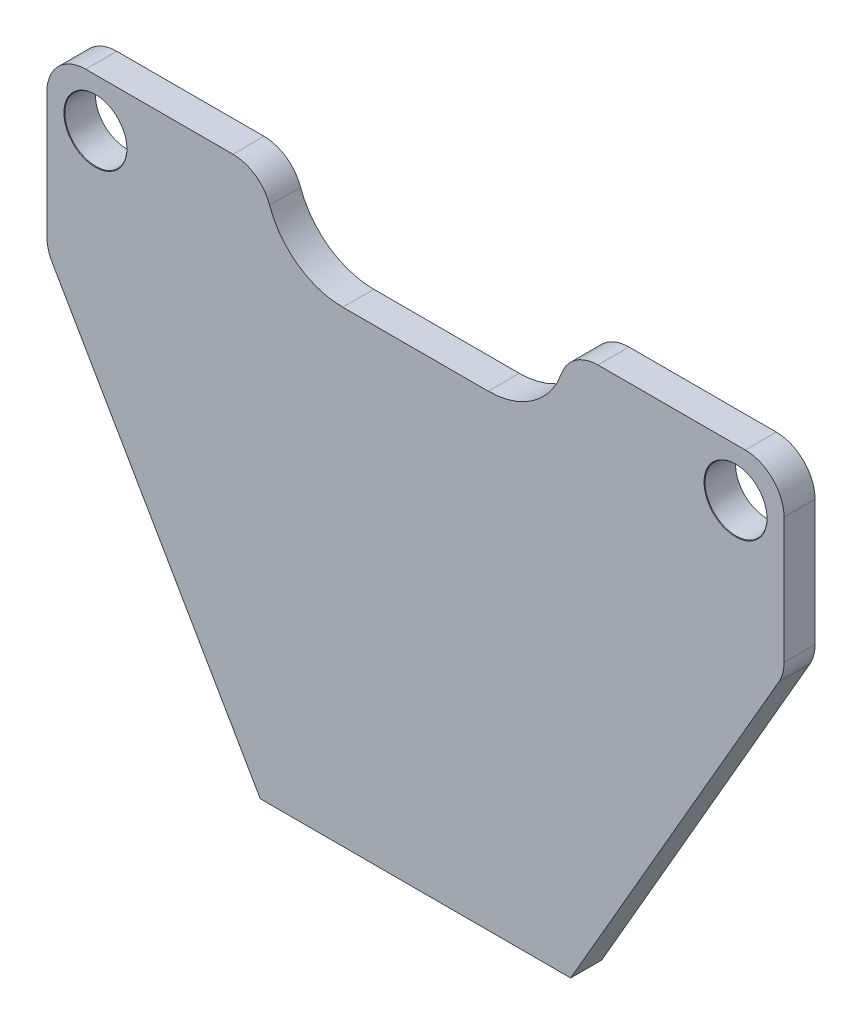
ISO-10303-21;
HEADER;
FILE_DESCRIPTION(('STEP AP214'),'2;1');
FILE_NAME('part.step','',(''),(''),'','','');
FILE_SCHEMA(('AUTOMOTIVE_DESIGN { 1 0 10303 214 1 1 1 1 }'));
ENDSEC;
DATA;
#1=APPLICATION_CONTEXT('core data for automotive mechanical design processes');
#2=APPLICATION_PROTOCOL_DEFINITION('international standard','automotive_design',2000,#1);
#3=PRODUCT_CONTEXT('',#1,'mechanical');
#4=PRODUCT('Part','Part','',(#3));
#5=PRODUCT_RELATED_PRODUCT_CATEGORY('part','',(#4));
#6=PRODUCT_DEFINITION_FORMATION('','',#4);
#7=PRODUCT_DEFINITION_CONTEXT('part definition',#1,'design');
#8=PRODUCT_DEFINITION('design','',#6,#7);
#9=PRODUCT_DEFINITION_SHAPE('','',#8);
#10=(LENGTH_UNIT() NAMED_UNIT(*) SI_UNIT(.MILLI.,.METRE.));
#11=(NAMED_UNIT(*) PLANE_ANGLE_UNIT() SI_UNIT($,.RADIAN.));
#12=(NAMED_UNIT(*) SI_UNIT($,.STERADIAN.) SOLID_ANGLE_UNIT());
#13=UNCERTAINTY_MEASURE_WITH_UNIT(LENGTH_MEASURE(1.E-05),#10,'distance_accuracy_value','');
#14=(GEOMETRIC_REPRESENTATION_CONTEXT(3) GLOBAL_UNCERTAINTY_ASSIGNED_CONTEXT((#13)) GLOBAL_UNIT_ASSIGNED_CONTEXT((#10,
#11,#12)) REPRESENTATION_CONTEXT('',''));
#15=CARTESIAN_POINT('',(0.,0.,0.));
#16=DIRECTION('',(0.,0.,1.));
#17=DIRECTION('',(1.,0.,0.));
#18=AXIS2_PLACEMENT_3D('',#15,#16,#17);
#19=CARTESIAN_POINT('',(-19.,38.0525588832576,1.6));
#20=DIRECTION('',(1.,0.,0.));
#21=DIRECTION('',(0.,0.,-1.));
#22=AXIS2_PLACEMENT_3D('',#19,#20,#21);
#23=PLANE('',#22);
#24=DIRECTION('',(0.,-1.,0.));
#25=VECTOR('',#24,1.);
#26=CARTESIAN_POINT('',(-19.,38.0525588832576,0.));
#27=LINE('',#26,#25);
#28=CARTESIAN_POINT('',(-19.,45.0731959577377,0.));
#29=VERTEX_POINT('',#28);
#30=CARTESIAN_POINT('',(-19.,38.5884572681199,0.));
#31=VERTEX_POINT('',#30);
#32=EDGE_CURVE('E210',#29,#31,#27,.T.);
#33=ORIENTED_EDGE('',*,*,#32,.T.);
#34=DIRECTION('',(0.,0.,-1.));
#35=VECTOR('',#34,1.);
#36=CARTESIAN_POINT('',(-19.,38.5884572681199,1.6));
#37=LINE('',#36,#35);
#38=CARTESIAN_POINT('',(-19.,38.5884572681199,1.6));
#39=VERTEX_POINT('',#38);
#40=EDGE_CURVE('E304',#31,#39,#37,.F.);
#41=ORIENTED_EDGE('',*,*,#40,.T.);
#42=DIRECTION('',(0.,-1.,0.));
#43=VECTOR('',#42,1.);
#44=CARTESIAN_POINT('',(-19.,38.0525588832576,1.6));
#45=LINE('',#44,#43);
#46=CARTESIAN_POINT('',(-19.,45.0731959577377,1.6));
#47=VERTEX_POINT('',#46);
#48=EDGE_CURVE('E165',#47,#39,#45,.T.);
#49=ORIENTED_EDGE('',*,*,#48,.F.);
#50=DIRECTION('',(0.,0.,-1.));
#51=VECTOR('',#50,1.);
#52=CARTESIAN_POINT('',(-19.,45.0731959577377,1.6));
#53=LINE('',#52,#51);
#54=EDGE_CURVE('E300',#47,#29,#53,.T.);
#55=ORIENTED_EDGE('',*,*,#54,.T.);
#56=EDGE_LOOP('',(#33,#41,#49,#55));
#57=FACE_BOUND('',#56,.T.);
#58=ADVANCED_FACE('F38',(#57),#23,.F.);
#59=CARTESIAN_POINT('',(-7.99999999999999,19.,1.6));
#60=DIRECTION('',(0.866025403784438,0.500000000000001,0.));
#61=DIRECTION('',(-0.500000000000001,0.866025403784438,0.));
#62=AXIS2_PLACEMENT_3D('',#59,#60,#61);
#63=PLANE('',#62);
#64=DIRECTION('',(0.500000000000001,-0.866025403784438,0.));
#65=VECTOR('',#64,1.);
#66=CARTESIAN_POINT('',(-7.99999999999999,19.,1.6));
#67=LINE('',#66,#65);
#68=CARTESIAN_POINT('',(-18.7320508075689,37.5884572681199,1.6));
#69=VERTEX_POINT('',#68);
#70=CARTESIAN_POINT('',(-7.99999999999999,19.,1.6));
#71=VERTEX_POINT('',#70);
#72=EDGE_CURVE('E151',#69,#71,#67,.T.);
#73=ORIENTED_EDGE('',*,*,#72,.F.);
#74=DIRECTION('',(0.,0.,-1.));
#75=VECTOR('',#74,1.);
#76=CARTESIAN_POINT('',(-18.7320508075689,37.5884572681199,1.6));
#77=LINE('',#76,#75);
#78=CARTESIAN_POINT('',(-18.7320508075689,37.5884572681199,0.));
#79=VERTEX_POINT('',#78);
#80=EDGE_CURVE('E297',#69,#79,#77,.T.);
#81=ORIENTED_EDGE('',*,*,#80,.T.);
#82=DIRECTION('',(0.500000000000001,-0.866025403784438,0.));
#83=VECTOR('',#82,1.);
#84=CARTESIAN_POINT('',(-7.99999999999999,19.,0.));
#85=LINE('',#84,#83);
#86=CARTESIAN_POINT('',(-7.99999999999999,19.,0.));
#87=VERTEX_POINT('',#86);
#88=EDGE_CURVE('E171',#79,#87,#85,.T.);
#89=ORIENTED_EDGE('',*,*,#88,.T.);
#90=DIRECTION('',(0.,0.,-1.));
#91=VECTOR('',#90,1.);
#92=CARTESIAN_POINT('',(-7.99999999999999,19.,1.6));
#93=LINE('',#92,#91);
#94=EDGE_CURVE('E168',#71,#87,#93,.T.);
#95=ORIENTED_EDGE('',*,*,#94,.F.);
#96=EDGE_LOOP('',(#73,#81,#89,#95));
#97=FACE_BOUND('',#96,.T.);
#98=ADVANCED_FACE('F169',(#97),#63,.F.);
#99=CARTESIAN_POINT('',(8.00000000000001,19.,1.6));
#100=DIRECTION('',(0.,1.,0.));
#101=DIRECTION('',(-1.,0.,0.));
#102=AXIS2_PLACEMENT_3D('',#99,#100,#101);
#103=PLANE('',#102);
#104=DIRECTION('',(1.,0.,0.));
#105=VECTOR('',#104,1.);
#106=CARTESIAN_POINT('',(8.00000000000001,19.,0.));
#107=LINE('',#106,#105);
#108=CARTESIAN_POINT('',(8.00000000000001,19.,0.));
#109=VERTEX_POINT('',#108);
#110=EDGE_CURVE('E217',#87,#109,#107,.T.);
#111=ORIENTED_EDGE('',*,*,#110,.T.);
#112=DIRECTION('',(0.,0.,-1.));
#113=VECTOR('',#112,1.);
#114=CARTESIAN_POINT('',(8.00000000000001,19.,1.6));
#115=LINE('',#114,#113);
#116=CARTESIAN_POINT('',(8.00000000000001,19.,1.6));
#117=VERTEX_POINT('',#116);
#118=EDGE_CURVE('E176',#117,#109,#115,.T.);
#119=ORIENTED_EDGE('',*,*,#118,.F.);
#120=DIRECTION('',(1.,0.,0.));
#121=VECTOR('',#120,1.);
#122=CARTESIAN_POINT('',(8.00000000000001,19.,1.6));
#123=LINE('',#122,#121);
#124=EDGE_CURVE('E156',#71,#117,#123,.T.);
#125=ORIENTED_EDGE('',*,*,#124,.F.);
#126=ORIENTED_EDGE('',*,*,#94,.T.);
#127=EDGE_LOOP('',(#111,#119,#125,#126));
#128=FACE_BOUND('',#127,.T.);
#129=ADVANCED_FACE('F178',(#128),#103,.F.);
#130=CARTESIAN_POINT('',(8.00000000000001,19.,1.6));
#131=DIRECTION('',(-0.866025403784438,0.500000000000001,0.));
#132=DIRECTION('',(-0.500000000000001,-0.866025403784438,0.));
#133=AXIS2_PLACEMENT_3D('',#130,#131,#132);
#134=PLANE('',#133);
#135=DIRECTION('',(0.500000000000001,0.866025403784438,0.));
#136=VECTOR('',#135,1.);
#137=CARTESIAN_POINT('',(8.00000000000001,19.,0.));
#138=LINE('',#137,#136);
#139=CARTESIAN_POINT('',(18.7320508075689,37.5884572681199,0.));
#140=VERTEX_POINT('',#139);
#141=EDGE_CURVE('E220',#109,#140,#138,.T.);
#142=ORIENTED_EDGE('',*,*,#141,.T.);
#143=DIRECTION('',(0.,0.,-1.));
#144=VECTOR('',#143,1.);
#145=CARTESIAN_POINT('',(18.7320508075689,37.5884572681199,1.6));
#146=LINE('',#145,#144);
#147=CARTESIAN_POINT('',(18.7320508075689,37.5884572681199,1.6));
#148=VERTEX_POINT('',#147);
#149=EDGE_CURVE('E278',#140,#148,#146,.F.);
#150=ORIENTED_EDGE('',*,*,#149,.T.);
#151=DIRECTION('',(0.500000000000001,0.866025403784438,0.));
#152=VECTOR('',#151,1.);
#153=CARTESIAN_POINT('',(8.00000000000001,19.,1.6));
#154=LINE('',#153,#152);
#155=EDGE_CURVE('E182',#117,#148,#154,.T.);
#156=ORIENTED_EDGE('',*,*,#155,.F.);
#157=ORIENTED_EDGE('',*,*,#118,.T.);
#158=EDGE_LOOP('',(#142,#150,#156,#157));
#159=FACE_BOUND('',#158,.T.);
#160=ADVANCED_FACE('F353',(#159),#134,.F.);
#161=CARTESIAN_POINT('',(19.,47.0731959577377,1.6));
#162=DIRECTION('',(-1.,0.,0.));
#163=DIRECTION('',(0.,-1.,0.));
#164=AXIS2_PLACEMENT_3D('',#161,#162,#163);
#165=PLANE('',#164);
#166=DIRECTION('',(0.,1.,0.));
#167=VECTOR('',#166,1.);
#168=CARTESIAN_POINT('',(19.,47.0731959577377,1.6));
#169=LINE('',#168,#167);
#170=CARTESIAN_POINT('',(19.,38.5884572681199,1.6));
#171=VERTEX_POINT('',#170);
#172=CARTESIAN_POINT('',(19.,45.0731959577377,1.6));
#173=VERTEX_POINT('',#172);
#174=EDGE_CURVE('E187',#171,#173,#169,.T.);
#175=ORIENTED_EDGE('',*,*,#174,.F.);
#176=DIRECTION('',(0.,0.,-1.));
#177=VECTOR('',#176,1.);
#178=CARTESIAN_POINT('',(19.,38.5884572681199,1.6));
#179=LINE('',#178,#177);
#180=CARTESIAN_POINT('',(19.,38.5884572681199,0.));
#181=VERTEX_POINT('',#180);
#182=EDGE_CURVE('E256',#171,#181,#179,.T.);
#183=ORIENTED_EDGE('',*,*,#182,.T.);
#184=DIRECTION('',(0.,1.,0.));
#185=VECTOR('',#184,1.);
#186=CARTESIAN_POINT('',(19.,47.0731959577377,0.));
#187=LINE('',#186,#185);
#188=CARTESIAN_POINT('',(19.,45.0731959577377,0.));
#189=VERTEX_POINT('',#188);
#190=EDGE_CURVE('E224',#181,#189,#187,.T.);
#191=ORIENTED_EDGE('',*,*,#190,.T.);
#192=DIRECTION('',(0.,0.,-1.));
#193=VECTOR('',#192,1.);
#194=CARTESIAN_POINT('',(19.,45.0731959577377,1.6));
#195=LINE('',#194,#193);
#196=EDGE_CURVE('E175',#189,#173,#195,.F.);
#197=ORIENTED_EDGE('',*,*,#196,.T.);
#198=EDGE_LOOP('',(#175,#183,#191,#197));
#199=FACE_BOUND('',#198,.T.);
#200=ADVANCED_FACE('F347',(#199),#165,.F.);
#201=CARTESIAN_POINT('',(7.75000000000001,47.0731959577377,1.6));
#202=DIRECTION('',(0.,-1.,0.));
#203=DIRECTION('',(1.,0.,0.));
#204=AXIS2_PLACEMENT_3D('',#201,#202,#203);
#205=PLANE('',#204);
#206=DIRECTION('',(-1.,0.,0.));
#207=VECTOR('',#206,1.);
#208=CARTESIAN_POINT('',(7.75000000000001,47.0731959577377,0.));
#209=LINE('',#208,#207);
#210=CARTESIAN_POINT('',(17.,47.0731959577377,0.));
#211=VERTEX_POINT('',#210);
#212=CARTESIAN_POINT('',(9.40685424949239,47.0731959577377,0.));
#213=VERTEX_POINT('',#212);
#214=EDGE_CURVE('E228',#211,#213,#209,.T.);
#215=ORIENTED_EDGE('',*,*,#214,.T.);
#216=DIRECTION('',(0.,0.,-1.));
#217=VECTOR('',#216,1.);
#218=CARTESIAN_POINT('',(9.40685424949239,47.0731959577377,1.6));
#219=LINE('',#218,#217);
#220=CARTESIAN_POINT('',(9.40685424949239,47.0731959577377,1.6));
#221=VERTEX_POINT('',#220);
#222=EDGE_CURVE('E11',#213,#221,#219,.F.);
#223=ORIENTED_EDGE('',*,*,#222,.T.);
#224=DIRECTION('',(-1.,0.,0.));
#225=VECTOR('',#224,1.);
#226=CARTESIAN_POINT('',(7.75000000000001,47.0731959577377,1.6));
#227=LINE('',#226,#225);
#228=CARTESIAN_POINT('',(17.,47.0731959577377,1.6));
#229=VERTEX_POINT('',#228);
#230=EDGE_CURVE('E194',#229,#221,#227,.T.);
#231=ORIENTED_EDGE('',*,*,#230,.F.);
#232=DIRECTION('',(0.,0.,-1.));
#233=VECTOR('',#232,1.);
#234=CARTESIAN_POINT('',(17.,47.0731959577377,1.6));
#235=LINE('',#234,#233);
#236=EDGE_CURVE('E47',#229,#211,#235,.T.);
#237=ORIENTED_EDGE('',*,*,#236,.T.);
#238=EDGE_LOOP('',(#215,#223,#231,#237));
#239=FACE_BOUND('',#238,.T.);
#240=ADVANCED_FACE('F325',(#239),#205,.F.);
#241=CARTESIAN_POINT('',(3.75,47.0731959577377,1.6));
#242=DIRECTION('',(0.,0.,-1.));
#243=DIRECTION('',(-1.,0.,0.));
#244=AXIS2_PLACEMENT_3D('',#241,#242,#243);
#245=CYLINDRICAL_SURFACE('',#244,4.);
#246=CARTESIAN_POINT('',(3.75,47.0731959577377,1.6));
#247=DIRECTION('',(0.,0.,-1.));
#248=DIRECTION('',(1.,0.,0.));
#249=AXIS2_PLACEMENT_3D('',#246,#247,#248);
#250=CIRCLE('',#249,4.);
#251=CARTESIAN_POINT('',(7.52123616632826,45.7398626244044,1.6));
#252=VERTEX_POINT('',#251);
#253=CARTESIAN_POINT('',(3.75,43.0731959577377,1.6));
#254=VERTEX_POINT('',#253);
#255=EDGE_CURVE('E197',#252,#254,#250,.T.);
#256=ORIENTED_EDGE('',*,*,#255,.F.);
#257=DIRECTION('',(0.,0.,-1.));
#258=VECTOR('',#257,1.);
#259=CARTESIAN_POINT('',(7.52123616632826,45.7398626244044,1.6));
#260=LINE('',#259,#258);
#261=CARTESIAN_POINT('',(7.52123616632826,45.7398626244044,0.));
#262=VERTEX_POINT('',#261);
#263=EDGE_CURVE('E316',#252,#262,#260,.T.);
#264=ORIENTED_EDGE('',*,*,#263,.T.);
#265=CARTESIAN_POINT('',(3.75,47.0731959577377,0.));
#266=DIRECTION('',(0.,0.,-1.));
#267=DIRECTION('',(1.,0.,0.));
#268=AXIS2_PLACEMENT_3D('',#265,#266,#267);
#269=CIRCLE('',#268,4.);
#270=CARTESIAN_POINT('',(3.75,43.0731959577377,0.));
#271=VERTEX_POINT('',#270);
#272=EDGE_CURVE('E232',#262,#271,#269,.T.);
#273=ORIENTED_EDGE('',*,*,#272,.T.);
#274=DIRECTION('',(0.,0.,-1.));
#275=VECTOR('',#274,1.);
#276=CARTESIAN_POINT('',(3.75,43.0731959577377,1.6));
#277=LINE('',#276,#275);
#278=EDGE_CURVE('E248',#254,#271,#277,.T.);
#279=ORIENTED_EDGE('',*,*,#278,.F.);
#280=EDGE_LOOP('',(#256,#264,#273,#279));
#281=FACE_BOUND('',#280,.T.);
#282=ADVANCED_FACE('F340',(#281),#245,.F.);
#283=CARTESIAN_POINT('',(-3.75,43.0731959577377,1.6));
#284=DIRECTION('',(0.,-1.,0.));
#285=DIRECTION('',(0.,0.,-1.));
#286=AXIS2_PLACEMENT_3D('',#283,#284,#285);
#287=PLANE('',#286);
#288=DIRECTION('',(-1.,0.,0.));
#289=VECTOR('',#288,1.);
#290=CARTESIAN_POINT('',(-3.75,43.0731959577377,0.));
#291=LINE('',#290,#289);
#292=CARTESIAN_POINT('',(-3.75,43.0731959577377,0.));
#293=VERTEX_POINT('',#292);
#294=EDGE_CURVE('E235',#271,#293,#291,.T.);
#295=ORIENTED_EDGE('',*,*,#294,.T.);
#296=DIRECTION('',(0.,0.,-1.));
#297=VECTOR('',#296,1.);
#298=CARTESIAN_POINT('',(-3.75,43.0731959577377,1.6));
#299=LINE('',#298,#297);
#300=CARTESIAN_POINT('',(-3.75,43.0731959577377,1.6));
#301=VERTEX_POINT('',#300);
#302=EDGE_CURVE('E209',#301,#293,#299,.T.);
#303=ORIENTED_EDGE('',*,*,#302,.F.);
#304=DIRECTION('',(-1.,0.,0.));
#305=VECTOR('',#304,1.);
#306=CARTESIAN_POINT('',(-3.75,43.0731959577377,1.6));
#307=LINE('',#306,#305);
#308=EDGE_CURVE('E200',#254,#301,#307,.T.);
#309=ORIENTED_EDGE('',*,*,#308,.F.);
#310=ORIENTED_EDGE('',*,*,#278,.T.);
#311=EDGE_LOOP('',(#295,#303,#309,#310));
#312=FACE_BOUND('',#311,.T.);
#313=ADVANCED_FACE('F388',(#312),#287,.F.);
#314=CARTESIAN_POINT('',(-3.75,47.0731959577377,1.6));
#315=DIRECTION('',(0.,0.,-1.));
#316=DIRECTION('',(-1.,0.,0.));
#317=AXIS2_PLACEMENT_3D('',#314,#315,#316);
#318=CYLINDRICAL_SURFACE('',#317,4.);
#319=CARTESIAN_POINT('',(-3.75,47.0731959577377,0.));
#320=DIRECTION('',(0.,0.,-1.));
#321=DIRECTION('',(1.,0.,0.));
#322=AXIS2_PLACEMENT_3D('',#319,#320,#321);
#323=CIRCLE('',#322,4.);
#324=CARTESIAN_POINT('',(-7.52123616632826,45.7398626244044,0.));
#325=VERTEX_POINT('',#324);
#326=EDGE_CURVE('E238',#293,#325,#323,.T.);
#327=ORIENTED_EDGE('',*,*,#326,.T.);
#328=DIRECTION('',(0.,0.,-1.));
#329=VECTOR('',#328,1.);
#330=CARTESIAN_POINT('',(-7.52123616632826,45.7398626244044,1.6));
#331=LINE('',#330,#329);
#332=CARTESIAN_POINT('',(-7.52123616632826,45.7398626244044,1.6));
#333=VERTEX_POINT('',#332);
#334=EDGE_CURVE('E313',#325,#333,#331,.F.);
#335=ORIENTED_EDGE('',*,*,#334,.T.);
#336=CARTESIAN_POINT('',(-3.75,47.0731959577377,1.6));
#337=DIRECTION('',(0.,0.,-1.));
#338=DIRECTION('',(1.,0.,0.));
#339=AXIS2_PLACEMENT_3D('',#336,#337,#338);
#340=CIRCLE('',#339,4.);
#341=EDGE_CURVE('E203',#301,#333,#340,.T.);
#342=ORIENTED_EDGE('',*,*,#341,.F.);
#343=ORIENTED_EDGE('',*,*,#302,.T.);
#344=EDGE_LOOP('',(#327,#335,#342,#343));
#345=FACE_BOUND('',#344,.T.);
#346=ADVANCED_FACE('F391',(#345),#318,.F.);
#347=CARTESIAN_POINT('',(-19.,47.0731959577377,1.6));
#348=DIRECTION('',(0.,-1.,0.));
#349=DIRECTION('',(1.,0.,0.));
#350=AXIS2_PLACEMENT_3D('',#347,#348,#349);
#351=PLANE('',#350);
#352=DIRECTION('',(-1.,0.,0.));
#353=VECTOR('',#352,1.);
#354=CARTESIAN_POINT('',(-19.,47.0731959577377,0.));
#355=LINE('',#354,#353);
#356=CARTESIAN_POINT('',(-9.40685424949239,47.0731959577377,0.));
#357=VERTEX_POINT('',#356);
#358=CARTESIAN_POINT('',(-17.,47.0731959577377,0.));
#359=VERTEX_POINT('',#358);
#360=EDGE_CURVE('E242',#357,#359,#355,.T.);
#361=ORIENTED_EDGE('',*,*,#360,.T.);
#362=DIRECTION('',(0.,0.,-1.));
#363=VECTOR('',#362,1.);
#364=CARTESIAN_POINT('',(-17.,47.0731959577377,1.6));
#365=LINE('',#364,#363);
#366=CARTESIAN_POINT('',(-17.,47.0731959577377,1.6));
#367=VERTEX_POINT('',#366);
#368=EDGE_CURVE('E54',#359,#367,#365,.F.);
#369=ORIENTED_EDGE('',*,*,#368,.T.);
#370=DIRECTION('',(-1.,0.,0.));
#371=VECTOR('',#370,1.);
#372=CARTESIAN_POINT('',(-19.,47.0731959577377,1.6));
#373=LINE('',#372,#371);
#374=CARTESIAN_POINT('',(-9.40685424949239,47.0731959577377,1.6));
#375=VERTEX_POINT('',#374);
#376=EDGE_CURVE('E206',#375,#367,#373,.T.);
#377=ORIENTED_EDGE('',*,*,#376,.F.);
#378=DIRECTION('',(0.,0.,-1.));
#379=VECTOR('',#378,1.);
#380=CARTESIAN_POINT('',(-9.40685424949239,47.0731959577377,1.6));
#381=LINE('',#380,#379);
#382=EDGE_CURVE('E307',#375,#357,#381,.T.);
#383=ORIENTED_EDGE('',*,*,#382,.T.);
#384=EDGE_LOOP('',(#361,#369,#377,#383));
#385=FACE_BOUND('',#384,.T.);
#386=ADVANCED_FACE('F395',(#385),#351,.F.);
#387=CARTESIAN_POINT('',(-3.75,47.0731959577377,1.6));
#388=DIRECTION('',(0.,0.,1.));
#389=DIRECTION('',(1.,0.,0.));
#390=AXIS2_PLACEMENT_3D('',#387,#388,#389);
#391=PLANE('',#390);
#392=CARTESIAN_POINT('',(16.5,44.5731959577377,1.6));
#393=DIRECTION('',(0.,0.,1.));
#394=DIRECTION('',(1.,0.,0.));
#395=AXIS2_PLACEMENT_3D('',#392,#393,#394);
#396=CIRCLE('',#395,1.625);
#397=CARTESIAN_POINT('',(18.125,44.5731959577377,1.6));
#398=VERTEX_POINT('',#397);
#399=EDGE_CURVE('E425',#398,#398,#396,.T.);
#400=ORIENTED_EDGE('',*,*,#399,.F.);
#401=EDGE_LOOP('',(#400));
#402=FACE_BOUND('',#401,.T.);
#403=CARTESIAN_POINT('',(-16.5,44.5731959577377,1.6));
#404=DIRECTION('',(0.,0.,1.));
#405=DIRECTION('',(1.,0.,0.));
#406=AXIS2_PLACEMENT_3D('',#403,#404,#405);
#407=CIRCLE('',#406,1.625);
#408=CARTESIAN_POINT('',(-14.875,44.5731959577377,1.6));
#409=VERTEX_POINT('',#408);
#410=EDGE_CURVE('E428',#409,#409,#407,.T.);
#411=ORIENTED_EDGE('',*,*,#410,.F.);
#412=EDGE_LOOP('',(#411));
#413=FACE_BOUND('',#412,.T.);
#414=ORIENTED_EDGE('',*,*,#155,.T.);
#415=CARTESIAN_POINT('',(17.,38.5884572681199,1.6));
#416=DIRECTION('',(0.,0.,1.));
#417=DIRECTION('',(1.,0.,0.));
#418=AXIS2_PLACEMENT_3D('',#415,#416,#417);
#419=CIRCLE('',#418,2.);
#420=EDGE_CURVE('E294',#148,#171,#419,.T.);
#421=ORIENTED_EDGE('',*,*,#420,.T.);
#422=ORIENTED_EDGE('',*,*,#174,.T.);
#423=CARTESIAN_POINT('',(17.,45.0731959577377,1.6));
#424=DIRECTION('',(0.,0.,1.));
#425=DIRECTION('',(1.,0.,0.));
#426=AXIS2_PLACEMENT_3D('',#423,#424,#425);
#427=CIRCLE('',#426,2.);
#428=EDGE_CURVE('E281',#173,#229,#427,.T.);
#429=ORIENTED_EDGE('',*,*,#428,.T.);
#430=ORIENTED_EDGE('',*,*,#230,.T.);
#431=CARTESIAN_POINT('',(9.40685424949239,45.0731959577377,1.6));
#432=DIRECTION('',(0.,0.,1.));
#433=DIRECTION('',(1.,0.,0.));
#434=AXIS2_PLACEMENT_3D('',#431,#432,#433);
#435=CIRCLE('',#434,2.);
#436=EDGE_CURVE('E284',#221,#252,#435,.T.);
#437=ORIENTED_EDGE('',*,*,#436,.T.);
#438=ORIENTED_EDGE('',*,*,#255,.T.);
#439=ORIENTED_EDGE('',*,*,#308,.T.);
#440=ORIENTED_EDGE('',*,*,#341,.T.);
#441=CARTESIAN_POINT('',(-9.40685424949239,45.0731959577377,1.6));
#442=DIRECTION('',(0.,0.,1.));
#443=DIRECTION('',(1.,0.,0.));
#444=AXIS2_PLACEMENT_3D('',#441,#442,#443);
#445=CIRCLE('',#444,2.);
#446=EDGE_CURVE('E61',#333,#375,#445,.T.);
#447=ORIENTED_EDGE('',*,*,#446,.T.);
#448=ORIENTED_EDGE('',*,*,#376,.T.);
#449=CARTESIAN_POINT('',(-17.,45.0731959577377,1.6));
#450=DIRECTION('',(0.,0.,1.));
#451=DIRECTION('',(1.,0.,0.));
#452=AXIS2_PLACEMENT_3D('',#449,#450,#451);
#453=CIRCLE('',#452,2.);
#454=EDGE_CURVE('E289',#367,#47,#453,.T.);
#455=ORIENTED_EDGE('',*,*,#454,.T.);
#456=ORIENTED_EDGE('',*,*,#48,.T.);
#457=CARTESIAN_POINT('',(-17.,38.5884572681199,1.6));
#458=DIRECTION('',(0.,0.,1.));
#459=DIRECTION('',(1.,0.,0.));
#460=AXIS2_PLACEMENT_3D('',#457,#458,#459);
#461=CIRCLE('',#460,2.);
#462=EDGE_CURVE('E160',#39,#69,#461,.T.);
#463=ORIENTED_EDGE('',*,*,#462,.T.);
#464=ORIENTED_EDGE('',*,*,#72,.T.);
#465=ORIENTED_EDGE('',*,*,#124,.T.);
#466=EDGE_LOOP('',(#414,#421,#422,#429,#430,#437,#438,#439,#440,#447,#448,#455,#456,#463,#464,#465));
#467=FACE_BOUND('',#466,.T.);
#468=ADVANCED_FACE('F154',(#402,#413,#467),#391,.T.);
#469=CARTESIAN_POINT('',(-3.75,47.0731959577377,0.));
#470=DIRECTION('',(0.,0.,1.));
#471=DIRECTION('',(1.,0.,0.));
#472=AXIS2_PLACEMENT_3D('',#469,#470,#471);
#473=PLANE('',#472);
#474=CARTESIAN_POINT('',(16.5,44.5731959577377,0.));
#475=DIRECTION('',(0.,0.,1.));
#476=DIRECTION('',(1.,0.,0.));
#477=AXIS2_PLACEMENT_3D('',#474,#475,#476);
#478=CIRCLE('',#477,1.59999999999999);
#479=CARTESIAN_POINT('',(18.1,44.5731959577377,0.));
#480=VERTEX_POINT('',#479);
#481=EDGE_CURVE('E420',#480,#480,#478,.T.);
#482=ORIENTED_EDGE('',*,*,#481,.T.);
#483=EDGE_LOOP('',(#482));
#484=FACE_BOUND('',#483,.T.);
#485=CARTESIAN_POINT('',(-16.5,44.5731959577377,0.));
#486=DIRECTION('',(0.,0.,1.));
#487=DIRECTION('',(1.,0.,0.));
#488=AXIS2_PLACEMENT_3D('',#485,#486,#487);
#489=CIRCLE('',#488,1.59999999999999);
#490=CARTESIAN_POINT('',(-14.9,44.5731959577377,0.));
#491=VERTEX_POINT('',#490);
#492=EDGE_CURVE('E214',#491,#491,#489,.T.);
#493=ORIENTED_EDGE('',*,*,#492,.T.);
#494=EDGE_LOOP('',(#493));
#495=FACE_BOUND('',#494,.T.);
#496=ORIENTED_EDGE('',*,*,#190,.F.);
#497=CARTESIAN_POINT('',(17.,38.5884572681199,0.));
#498=DIRECTION('',(0.,0.,1.));
#499=DIRECTION('',(1.,0.,0.));
#500=AXIS2_PLACEMENT_3D('',#497,#498,#499);
#501=CIRCLE('',#500,2.);
#502=EDGE_CURVE('E275',#181,#140,#501,.F.);
#503=ORIENTED_EDGE('',*,*,#502,.T.);
#504=ORIENTED_EDGE('',*,*,#141,.F.);
#505=ORIENTED_EDGE('',*,*,#110,.F.);
#506=ORIENTED_EDGE('',*,*,#88,.F.);
#507=CARTESIAN_POINT('',(-17.,38.5884572681199,0.));
#508=DIRECTION('',(0.,0.,1.));
#509=DIRECTION('',(1.,0.,0.));
#510=AXIS2_PLACEMENT_3D('',#507,#508,#509);
#511=CIRCLE('',#510,2.);
#512=EDGE_CURVE('E272',#79,#31,#511,.F.);
#513=ORIENTED_EDGE('',*,*,#512,.T.);
#514=ORIENTED_EDGE('',*,*,#32,.F.);
#515=CARTESIAN_POINT('',(-17.,45.0731959577377,0.));
#516=DIRECTION('',(0.,0.,1.));
#517=DIRECTION('',(1.,0.,0.));
#518=AXIS2_PLACEMENT_3D('',#515,#516,#517);
#519=CIRCLE('',#518,2.);
#520=EDGE_CURVE('E269',#29,#359,#519,.F.);
#521=ORIENTED_EDGE('',*,*,#520,.T.);
#522=ORIENTED_EDGE('',*,*,#360,.F.);
#523=CARTESIAN_POINT('',(-9.40685424949239,45.0731959577377,0.));
#524=DIRECTION('',(0.,0.,1.));
#525=DIRECTION('',(1.,0.,0.));
#526=AXIS2_PLACEMENT_3D('',#523,#524,#525);
#527=CIRCLE('',#526,2.);
#528=EDGE_CURVE('E266',#357,#325,#527,.F.);
#529=ORIENTED_EDGE('',*,*,#528,.T.);
#530=ORIENTED_EDGE('',*,*,#326,.F.);
#531=ORIENTED_EDGE('',*,*,#294,.F.);
#532=ORIENTED_EDGE('',*,*,#272,.F.);
#533=CARTESIAN_POINT('',(9.40685424949239,45.0731959577377,0.));
#534=DIRECTION('',(0.,0.,1.));
#535=DIRECTION('',(1.,0.,0.));
#536=AXIS2_PLACEMENT_3D('',#533,#534,#535);
#537=CIRCLE('',#536,2.);
#538=EDGE_CURVE('E263',#262,#213,#537,.F.);
#539=ORIENTED_EDGE('',*,*,#538,.T.);
#540=ORIENTED_EDGE('',*,*,#214,.F.);
#541=CARTESIAN_POINT('',(17.,45.0731959577377,0.));
#542=DIRECTION('',(0.,0.,1.));
#543=DIRECTION('',(1.,0.,0.));
#544=AXIS2_PLACEMENT_3D('',#541,#542,#543);
#545=CIRCLE('',#544,2.);
#546=EDGE_CURVE('E260',#211,#189,#545,.F.);
#547=ORIENTED_EDGE('',*,*,#546,.T.);
#548=EDGE_LOOP('',(#496,#503,#504,#505,#506,#513,#514,#521,#522,#529,#530,#531,#532,#539,#540,#547));
#549=FACE_BOUND('',#548,.T.);
#550=ADVANCED_FACE('F331',(#484,#495,#549),#473,.F.);
#551=CARTESIAN_POINT('',(-16.5,44.5731959577377,1.6));
#552=DIRECTION('',(0.,0.,1.));
#553=DIRECTION('',(1.,0.,0.));
#554=AXIS2_PLACEMENT_3D('',#551,#552,#553);
#555=CYLINDRICAL_SURFACE('',#554,1.59999999999999);
#556=ORIENTED_EDGE('',*,*,#492,.F.);
#557=EDGE_LOOP('',(#556));
#558=FACE_BOUND('',#557,.T.);
#559=CARTESIAN_POINT('',(-16.5,44.5731959577377,1.575));
#560=DIRECTION('',(0.,0.,1.));
#561=DIRECTION('',(1.,0.,0.));
#562=AXIS2_PLACEMENT_3D('',#559,#560,#561);
#563=CIRCLE('',#562,1.6);
#564=CARTESIAN_POINT('',(-14.9,44.5731959577377,1.575));
#565=VERTEX_POINT('',#564);
#566=EDGE_CURVE('E436',#565,#565,#563,.T.);
#567=ORIENTED_EDGE('',*,*,#566,.T.);
#568=EDGE_LOOP('',(#567));
#569=FACE_BOUND('',#568,.T.);
#570=ADVANCED_FACE('F401',(#558,#569),#555,.F.);
#571=CARTESIAN_POINT('',(-16.5,44.5731959577377,1.6));
#572=DIRECTION('',(0.,0.,1.));
#573=DIRECTION('',(1.,0.,0.));
#574=AXIS2_PLACEMENT_3D('',#571,#572,#573);
#575=CONICAL_SURFACE('',#574,1.625,0.785398163397379);
#576=ORIENTED_EDGE('',*,*,#566,.F.);
#577=EDGE_LOOP('',(#576));
#578=FACE_BOUND('',#577,.T.);
#579=ORIENTED_EDGE('',*,*,#410,.T.);
#580=EDGE_LOOP('',(#579));
#581=FACE_BOUND('',#580,.T.);
#582=ADVANCED_FACE('F408',(#578,#581),#575,.F.);
#583=CARTESIAN_POINT('',(16.5,44.5731959577377,1.6));
#584=DIRECTION('',(0.,0.,1.));
#585=DIRECTION('',(1.,0.,0.));
#586=AXIS2_PLACEMENT_3D('',#583,#584,#585);
#587=CYLINDRICAL_SURFACE('',#586,1.59999999999999);
#588=ORIENTED_EDGE('',*,*,#481,.F.);
#589=EDGE_LOOP('',(#588));
#590=FACE_BOUND('',#589,.T.);
#591=CARTESIAN_POINT('',(16.5,44.5731959577377,1.575));
#592=DIRECTION('',(0.,0.,1.));
#593=DIRECTION('',(1.,0.,0.));
#594=AXIS2_PLACEMENT_3D('',#591,#592,#593);
#595=CIRCLE('',#594,1.6);
#596=CARTESIAN_POINT('',(18.1,44.5731959577377,1.575));
#597=VERTEX_POINT('',#596);
#598=EDGE_CURVE('E423',#597,#597,#595,.T.);
#599=ORIENTED_EDGE('',*,*,#598,.T.);
#600=EDGE_LOOP('',(#599));
#601=FACE_BOUND('',#600,.T.);
#602=ADVANCED_FACE('F367',(#590,#601),#587,.F.);
#603=CARTESIAN_POINT('',(16.5,44.5731959577377,1.6));
#604=DIRECTION('',(0.,0.,1.));
#605=DIRECTION('',(1.,0.,0.));
#606=AXIS2_PLACEMENT_3D('',#603,#604,#605);
#607=CONICAL_SURFACE('',#606,1.625,0.785398163397414);
#608=ORIENTED_EDGE('',*,*,#598,.F.);
#609=EDGE_LOOP('',(#608));
#610=FACE_BOUND('',#609,.T.);
#611=ORIENTED_EDGE('',*,*,#399,.T.);
#612=EDGE_LOOP('',(#611));
#613=FACE_BOUND('',#612,.T.);
#614=ADVANCED_FACE('F358',(#610,#613),#607,.F.);
#615=CARTESIAN_POINT('',(17.,38.5884572681199,1.6));
#616=DIRECTION('',(0.,0.,-1.));
#617=DIRECTION('',(-1.,0.,0.));
#618=AXIS2_PLACEMENT_3D('',#615,#616,#617);
#619=CYLINDRICAL_SURFACE('',#618,2.);
#620=ORIENTED_EDGE('',*,*,#420,.F.);
#621=ORIENTED_EDGE('',*,*,#149,.F.);
#622=ORIENTED_EDGE('',*,*,#502,.F.);
#623=ORIENTED_EDGE('',*,*,#182,.F.);
#624=EDGE_LOOP('',(#620,#621,#622,#623));
#625=FACE_BOUND('',#624,.T.);
#626=ADVANCED_FACE('F355',(#625),#619,.T.);
#627=CARTESIAN_POINT('',(-17.,38.5884572681199,1.6));
#628=DIRECTION('',(0.,0.,-1.));
#629=DIRECTION('',(-1.,0.,0.));
#630=AXIS2_PLACEMENT_3D('',#627,#628,#629);
#631=CYLINDRICAL_SURFACE('',#630,2.);
#632=ORIENTED_EDGE('',*,*,#462,.F.);
#633=ORIENTED_EDGE('',*,*,#40,.F.);
#634=ORIENTED_EDGE('',*,*,#512,.F.);
#635=ORIENTED_EDGE('',*,*,#80,.F.);
#636=EDGE_LOOP('',(#632,#633,#634,#635));
#637=FACE_BOUND('',#636,.T.);
#638=ADVANCED_FACE('F357',(#637),#631,.T.);
#639=CARTESIAN_POINT('',(-17.,45.0731959577377,1.6));
#640=DIRECTION('',(0.,0.,-1.));
#641=DIRECTION('',(-1.,0.,0.));
#642=AXIS2_PLACEMENT_3D('',#639,#640,#641);
#643=CYLINDRICAL_SURFACE('',#642,2.);
#644=ORIENTED_EDGE('',*,*,#454,.F.);
#645=ORIENTED_EDGE('',*,*,#368,.F.);
#646=ORIENTED_EDGE('',*,*,#520,.F.);
#647=ORIENTED_EDGE('',*,*,#54,.F.);
#648=EDGE_LOOP('',(#644,#645,#646,#647));
#649=FACE_BOUND('',#648,.T.);
#650=ADVANCED_FACE('F364',(#649),#643,.T.);
#651=CARTESIAN_POINT('',(-9.40685424949239,45.0731959577377,1.6));
#652=DIRECTION('',(0.,0.,-1.));
#653=DIRECTION('',(-1.,0.,0.));
#654=AXIS2_PLACEMENT_3D('',#651,#652,#653);
#655=CYLINDRICAL_SURFACE('',#654,2.);
#656=ORIENTED_EDGE('',*,*,#446,.F.);
#657=ORIENTED_EDGE('',*,*,#334,.F.);
#658=ORIENTED_EDGE('',*,*,#528,.F.);
#659=ORIENTED_EDGE('',*,*,#382,.F.);
#660=EDGE_LOOP('',(#656,#657,#658,#659));
#661=FACE_BOUND('',#660,.T.);
#662=ADVANCED_FACE('F452',(#661),#655,.T.);
#663=CARTESIAN_POINT('',(9.40685424949239,45.0731959577377,1.6));
#664=DIRECTION('',(0.,0.,-1.));
#665=DIRECTION('',(-1.,0.,0.));
#666=AXIS2_PLACEMENT_3D('',#663,#664,#665);
#667=CYLINDRICAL_SURFACE('',#666,2.);
#668=ORIENTED_EDGE('',*,*,#436,.F.);
#669=ORIENTED_EDGE('',*,*,#222,.F.);
#670=ORIENTED_EDGE('',*,*,#538,.F.);
#671=ORIENTED_EDGE('',*,*,#263,.F.);
#672=EDGE_LOOP('',(#668,#669,#670,#671));
#673=FACE_BOUND('',#672,.T.);
#674=ADVANCED_FACE('F337',(#673),#667,.T.);
#675=CARTESIAN_POINT('',(17.,45.0731959577377,1.6));
#676=DIRECTION('',(0.,0.,-1.));
#677=DIRECTION('',(-1.,0.,0.));
#678=AXIS2_PLACEMENT_3D('',#675,#676,#677);
#679=CYLINDRICAL_SURFACE('',#678,2.);
#680=ORIENTED_EDGE('',*,*,#428,.F.);
#681=ORIENTED_EDGE('',*,*,#196,.F.);
#682=ORIENTED_EDGE('',*,*,#546,.F.);
#683=ORIENTED_EDGE('',*,*,#236,.F.);
#684=EDGE_LOOP('',(#680,#681,#682,#683));
#685=FACE_BOUND('',#684,.T.);
#686=ADVANCED_FACE('F40',(#685),#679,.T.);
#687=CLOSED_SHELL('',(#58,#98,#129,#160,#200,#240,#282,#313,#346,#386,#468,#550,#570,#582,#602,
#614,#626,#638,#650,#662,#674,#686));
#688=MANIFOLD_SOLID_BREP('B2',#687);
#689=ADVANCED_BREP_SHAPE_REPRESENTATION('',(#18,#688),#14);
#690=SHAPE_DEFINITION_REPRESENTATION(#9,#689);
ENDSEC;
END-ISO-10303-21;
